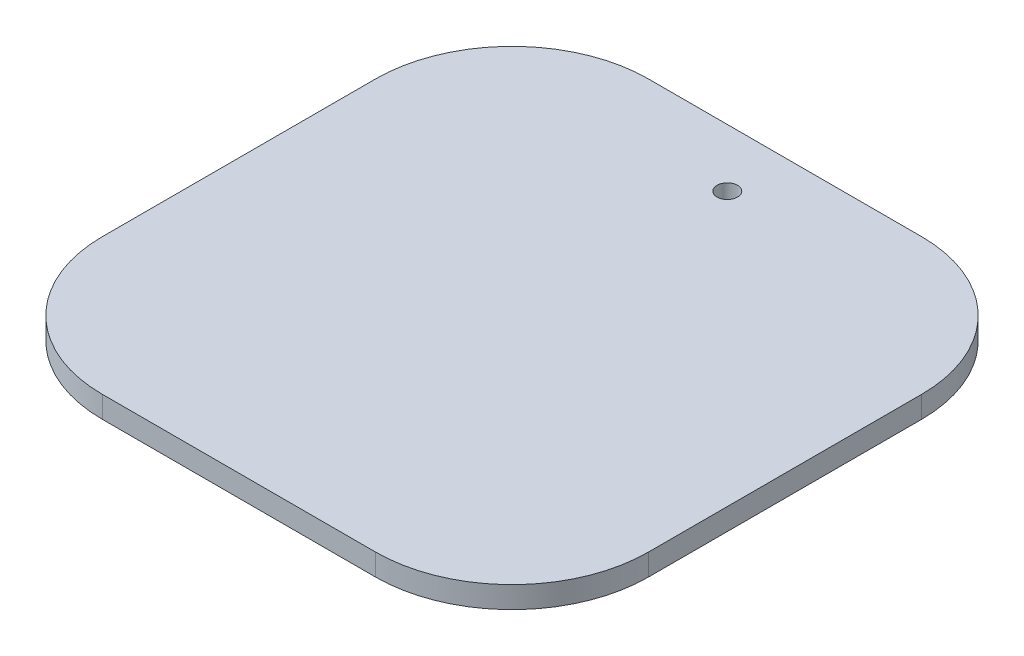
ISO-10303-21;
HEADER;
FILE_DESCRIPTION(('STEP AP214'),'2;1');
FILE_NAME('part.step','',(''),(''),'','','');
FILE_SCHEMA(('AUTOMOTIVE_DESIGN { 1 0 10303 214 1 1 1 1 }'));
ENDSEC;
DATA;
#1=APPLICATION_CONTEXT('core data for automotive mechanical design processes');
#2=APPLICATION_PROTOCOL_DEFINITION('international standard','automotive_design',2000,#1);
#3=PRODUCT_CONTEXT('',#1,'mechanical');
#4=PRODUCT('Part','Part','',(#3));
#5=PRODUCT_RELATED_PRODUCT_CATEGORY('part','',(#4));
#6=PRODUCT_DEFINITION_FORMATION('','',#4);
#7=PRODUCT_DEFINITION_CONTEXT('part definition',#1,'design');
#8=PRODUCT_DEFINITION('design','',#6,#7);
#9=PRODUCT_DEFINITION_SHAPE('','',#8);
#10=(LENGTH_UNIT() NAMED_UNIT(*) SI_UNIT(.MILLI.,.METRE.));
#11=(NAMED_UNIT(*) PLANE_ANGLE_UNIT() SI_UNIT($,.RADIAN.));
#12=(NAMED_UNIT(*) SI_UNIT($,.STERADIAN.) SOLID_ANGLE_UNIT());
#13=UNCERTAINTY_MEASURE_WITH_UNIT(LENGTH_MEASURE(1.E-05),#10,'distance_accuracy_value','');
#14=(GEOMETRIC_REPRESENTATION_CONTEXT(3) GLOBAL_UNCERTAINTY_ASSIGNED_CONTEXT((#13)) GLOBAL_UNIT_ASSIGNED_CONTEXT((#10,
#11,#12)) REPRESENTATION_CONTEXT('',''));
#15=CARTESIAN_POINT('',(0.,0.,0.));
#16=DIRECTION('',(0.,0.,1.));
#17=DIRECTION('',(1.,0.,0.));
#18=AXIS2_PLACEMENT_3D('',#15,#16,#17);
#19=CARTESIAN_POINT('',(30.,4.7625,30.));
#20=DIRECTION('',(0.,-1.,0.));
#21=DIRECTION('',(0.,0.,-1.));
#22=AXIS2_PLACEMENT_3D('',#19,#20,#21);
#23=CYLINDRICAL_SURFACE('',#22,30.);
#24=CARTESIAN_POINT('',(30.,0.,30.));
#25=DIRECTION('',(0.,1.,0.));
#26=DIRECTION('',(0.,0.,1.));
#27=AXIS2_PLACEMENT_3D('',#24,#25,#26);
#28=CIRCLE('',#27,30.);
#29=CARTESIAN_POINT('',(29.9999999999998,0.,60.));
#30=VERTEX_POINT('',#29);
#31=CARTESIAN_POINT('',(60.,0.,29.9999999999998));
#32=VERTEX_POINT('',#31);
#33=EDGE_CURVE('E132',#30,#32,#28,.T.);
#34=ORIENTED_EDGE('',*,*,#33,.T.);
#35=DIRECTION('',(0.,-1.,0.));
#36=VECTOR('',#35,1.);
#37=CARTESIAN_POINT('',(60.,4.7625,29.9999999999998));
#38=LINE('',#37,#36);
#39=CARTESIAN_POINT('',(60.,4.7625,29.9999999999998));
#40=VERTEX_POINT('',#39);
#41=EDGE_CURVE('E11',#40,#32,#38,.T.);
#42=ORIENTED_EDGE('',*,*,#41,.F.);
#43=CARTESIAN_POINT('',(30.,4.7625,30.));
#44=DIRECTION('',(0.,1.,0.));
#45=DIRECTION('',(0.,0.,1.));
#46=AXIS2_PLACEMENT_3D('',#43,#44,#45);
#47=CIRCLE('',#46,30.);
#48=CARTESIAN_POINT('',(29.9999999999998,4.7625,60.));
#49=VERTEX_POINT('',#48);
#50=EDGE_CURVE('E146',#49,#40,#47,.T.);
#51=ORIENTED_EDGE('',*,*,#50,.F.);
#52=DIRECTION('',(0.,-1.,0.));
#53=VECTOR('',#52,1.);
#54=CARTESIAN_POINT('',(29.9999999999998,4.7625,60.));
#55=LINE('',#54,#53);
#56=EDGE_CURVE('E128',#49,#30,#55,.T.);
#57=ORIENTED_EDGE('',*,*,#56,.T.);
#58=EDGE_LOOP('',(#34,#42,#51,#57));
#59=FACE_BOUND('',#58,.T.);
#60=ADVANCED_FACE('F35',(#59),#23,.T.);
#61=CARTESIAN_POINT('',(60.,4.7625,-29.9999999999998));
#62=DIRECTION('',(-1.,0.,0.));
#63=DIRECTION('',(0.,0.,1.));
#64=AXIS2_PLACEMENT_3D('',#61,#62,#63);
#65=PLANE('',#64);
#66=DIRECTION('',(0.,0.,-1.));
#67=VECTOR('',#66,1.);
#68=CARTESIAN_POINT('',(60.,0.,-29.9999999999998));
#69=LINE('',#68,#67);
#70=CARTESIAN_POINT('',(60.,0.,-29.9999999999998));
#71=VERTEX_POINT('',#70);
#72=EDGE_CURVE('E135',#32,#71,#69,.T.);
#73=ORIENTED_EDGE('',*,*,#72,.T.);
#74=DIRECTION('',(0.,-1.,0.));
#75=VECTOR('',#74,1.);
#76=CARTESIAN_POINT('',(60.,4.7625,-29.9999999999998));
#77=LINE('',#76,#75);
#78=CARTESIAN_POINT('',(60.,4.7625,-29.9999999999998));
#79=VERTEX_POINT('',#78);
#80=EDGE_CURVE('E44',#79,#71,#77,.T.);
#81=ORIENTED_EDGE('',*,*,#80,.F.);
#82=DIRECTION('',(0.,0.,-1.));
#83=VECTOR('',#82,1.);
#84=CARTESIAN_POINT('',(60.,4.7625,-29.9999999999998));
#85=LINE('',#84,#83);
#86=EDGE_CURVE('E95',#40,#79,#85,.T.);
#87=ORIENTED_EDGE('',*,*,#86,.F.);
#88=ORIENTED_EDGE('',*,*,#41,.T.);
#89=EDGE_LOOP('',(#73,#81,#87,#88));
#90=FACE_BOUND('',#89,.T.);
#91=ADVANCED_FACE('F197',(#90),#65,.F.);
#92=CARTESIAN_POINT('',(30.,4.7625,-30.));
#93=DIRECTION('',(0.,-1.,0.));
#94=DIRECTION('',(0.,0.,-1.));
#95=AXIS2_PLACEMENT_3D('',#92,#93,#94);
#96=CYLINDRICAL_SURFACE('',#95,30.);
#97=CARTESIAN_POINT('',(30.,0.,-30.));
#98=DIRECTION('',(0.,1.,0.));
#99=DIRECTION('',(0.,0.,1.));
#100=AXIS2_PLACEMENT_3D('',#97,#98,#99);
#101=CIRCLE('',#100,30.);
#102=CARTESIAN_POINT('',(29.9999999999998,0.,-60.));
#103=VERTEX_POINT('',#102);
#104=EDGE_CURVE('E137',#71,#103,#101,.T.);
#105=ORIENTED_EDGE('',*,*,#104,.T.);
#106=DIRECTION('',(0.,-1.,0.));
#107=VECTOR('',#106,1.);
#108=CARTESIAN_POINT('',(29.9999999999998,4.7625,-60.));
#109=LINE('',#108,#107);
#110=CARTESIAN_POINT('',(29.9999999999998,4.7625,-60.));
#111=VERTEX_POINT('',#110);
#112=EDGE_CURVE('E153',#111,#103,#109,.T.);
#113=ORIENTED_EDGE('',*,*,#112,.F.);
#114=CARTESIAN_POINT('',(30.,4.7625,-30.));
#115=DIRECTION('',(0.,1.,0.));
#116=DIRECTION('',(0.,0.,1.));
#117=AXIS2_PLACEMENT_3D('',#114,#115,#116);
#118=CIRCLE('',#117,30.);
#119=EDGE_CURVE('E162',#79,#111,#118,.T.);
#120=ORIENTED_EDGE('',*,*,#119,.F.);
#121=ORIENTED_EDGE('',*,*,#80,.T.);
#122=EDGE_LOOP('',(#105,#113,#120,#121));
#123=FACE_BOUND('',#122,.T.);
#124=ADVANCED_FACE('F160',(#123),#96,.T.);
#125=CARTESIAN_POINT('',(-29.9999999999998,4.7625,-60.));
#126=DIRECTION('',(0.,0.,1.));
#127=DIRECTION('',(1.,0.,0.));
#128=AXIS2_PLACEMENT_3D('',#125,#126,#127);
#129=PLANE('',#128);
#130=DIRECTION('',(-1.,0.,0.));
#131=VECTOR('',#130,1.);
#132=CARTESIAN_POINT('',(-29.9999999999998,0.,-60.));
#133=LINE('',#132,#131);
#134=CARTESIAN_POINT('',(-29.9999999999998,0.,-60.));
#135=VERTEX_POINT('',#134);
#136=EDGE_CURVE('E139',#103,#135,#133,.T.);
#137=ORIENTED_EDGE('',*,*,#136,.T.);
#138=DIRECTION('',(0.,-1.,0.));
#139=VECTOR('',#138,1.);
#140=CARTESIAN_POINT('',(-29.9999999999998,4.7625,-60.));
#141=LINE('',#140,#139);
#142=CARTESIAN_POINT('',(-29.9999999999998,4.7625,-60.));
#143=VERTEX_POINT('',#142);
#144=EDGE_CURVE('E150',#143,#135,#141,.T.);
#145=ORIENTED_EDGE('',*,*,#144,.F.);
#146=DIRECTION('',(-1.,0.,0.));
#147=VECTOR('',#146,1.);
#148=CARTESIAN_POINT('',(-29.9999999999998,4.7625,-60.));
#149=LINE('',#148,#147);
#150=EDGE_CURVE('E174',#111,#143,#149,.T.);
#151=ORIENTED_EDGE('',*,*,#150,.F.);
#152=ORIENTED_EDGE('',*,*,#112,.T.);
#153=EDGE_LOOP('',(#137,#145,#151,#152));
#154=FACE_BOUND('',#153,.T.);
#155=ADVANCED_FACE('F170',(#154),#129,.F.);
#156=CARTESIAN_POINT('',(-30.,4.7625,-30.));
#157=DIRECTION('',(0.,-1.,0.));
#158=DIRECTION('',(0.,0.,-1.));
#159=AXIS2_PLACEMENT_3D('',#156,#157,#158);
#160=CYLINDRICAL_SURFACE('',#159,30.);
#161=CARTESIAN_POINT('',(-30.,0.,-30.));
#162=DIRECTION('',(0.,1.,0.));
#163=DIRECTION('',(0.,0.,1.));
#164=AXIS2_PLACEMENT_3D('',#161,#162,#163);
#165=CIRCLE('',#164,30.);
#166=CARTESIAN_POINT('',(-60.,0.,-29.9999999999998));
#167=VERTEX_POINT('',#166);
#168=EDGE_CURVE('E141',#135,#167,#165,.T.);
#169=ORIENTED_EDGE('',*,*,#168,.T.);
#170=DIRECTION('',(0.,-1.,0.));
#171=VECTOR('',#170,1.);
#172=CARTESIAN_POINT('',(-60.,4.7625,-29.9999999999998));
#173=LINE('',#172,#171);
#174=CARTESIAN_POINT('',(-60.,4.7625,-29.9999999999998));
#175=VERTEX_POINT('',#174);
#176=EDGE_CURVE('E123',#175,#167,#173,.T.);
#177=ORIENTED_EDGE('',*,*,#176,.F.);
#178=CARTESIAN_POINT('',(-30.,4.7625,-30.));
#179=DIRECTION('',(0.,1.,0.));
#180=DIRECTION('',(0.,0.,1.));
#181=AXIS2_PLACEMENT_3D('',#178,#179,#180);
#182=CIRCLE('',#181,30.);
#183=EDGE_CURVE('E114',#143,#175,#182,.T.);
#184=ORIENTED_EDGE('',*,*,#183,.F.);
#185=ORIENTED_EDGE('',*,*,#144,.T.);
#186=EDGE_LOOP('',(#169,#177,#184,#185));
#187=FACE_BOUND('',#186,.T.);
#188=ADVANCED_FACE('F173',(#187),#160,.T.);
#189=CARTESIAN_POINT('',(-60.,4.7625,-29.9999999999998));
#190=DIRECTION('',(1.,0.,0.));
#191=DIRECTION('',(0.,0.,-1.));
#192=AXIS2_PLACEMENT_3D('',#189,#190,#191);
#193=PLANE('',#192);
#194=DIRECTION('',(0.,0.,1.));
#195=VECTOR('',#194,1.);
#196=CARTESIAN_POINT('',(-60.,0.,-29.9999999999998));
#197=LINE('',#196,#195);
#198=CARTESIAN_POINT('',(-60.,0.,29.9999999999998));
#199=VERTEX_POINT('',#198);
#200=EDGE_CURVE('E122',#167,#199,#197,.T.);
#201=ORIENTED_EDGE('',*,*,#200,.T.);
#202=DIRECTION('',(0.,-1.,0.));
#203=VECTOR('',#202,1.);
#204=CARTESIAN_POINT('',(-60.,4.7625,29.9999999999998));
#205=LINE('',#204,#203);
#206=CARTESIAN_POINT('',(-60.,4.7625,29.9999999999998));
#207=VERTEX_POINT('',#206);
#208=EDGE_CURVE('E119',#207,#199,#205,.T.);
#209=ORIENTED_EDGE('',*,*,#208,.F.);
#210=DIRECTION('',(0.,0.,1.));
#211=VECTOR('',#210,1.);
#212=CARTESIAN_POINT('',(-60.,4.7625,-29.9999999999998));
#213=LINE('',#212,#211);
#214=EDGE_CURVE('E108',#175,#207,#213,.T.);
#215=ORIENTED_EDGE('',*,*,#214,.F.);
#216=ORIENTED_EDGE('',*,*,#176,.T.);
#217=EDGE_LOOP('',(#201,#209,#215,#216));
#218=FACE_BOUND('',#217,.T.);
#219=ADVANCED_FACE('F120',(#218),#193,.F.);
#220=CARTESIAN_POINT('',(-30.,4.7625,30.));
#221=DIRECTION('',(0.,-1.,0.));
#222=DIRECTION('',(0.,0.,-1.));
#223=AXIS2_PLACEMENT_3D('',#220,#221,#222);
#224=CYLINDRICAL_SURFACE('',#223,30.);
#225=CARTESIAN_POINT('',(-30.,0.,30.));
#226=DIRECTION('',(0.,1.,0.));
#227=DIRECTION('',(0.,0.,1.));
#228=AXIS2_PLACEMENT_3D('',#225,#226,#227);
#229=CIRCLE('',#228,30.);
#230=CARTESIAN_POINT('',(-29.9999999999998,0.,60.));
#231=VERTEX_POINT('',#230);
#232=EDGE_CURVE('E81',#199,#231,#229,.T.);
#233=ORIENTED_EDGE('',*,*,#232,.T.);
#234=DIRECTION('',(0.,-1.,0.));
#235=VECTOR('',#234,1.);
#236=CARTESIAN_POINT('',(-29.9999999999998,4.7625,60.));
#237=LINE('',#236,#235);
#238=CARTESIAN_POINT('',(-29.9999999999998,4.7625,60.));
#239=VERTEX_POINT('',#238);
#240=EDGE_CURVE('E124',#239,#231,#237,.T.);
#241=ORIENTED_EDGE('',*,*,#240,.F.);
#242=CARTESIAN_POINT('',(-30.,4.7625,30.));
#243=DIRECTION('',(0.,1.,0.));
#244=DIRECTION('',(0.,0.,1.));
#245=AXIS2_PLACEMENT_3D('',#242,#243,#244);
#246=CIRCLE('',#245,30.);
#247=EDGE_CURVE('E112',#207,#239,#246,.T.);
#248=ORIENTED_EDGE('',*,*,#247,.F.);
#249=ORIENTED_EDGE('',*,*,#208,.T.);
#250=EDGE_LOOP('',(#233,#241,#248,#249));
#251=FACE_BOUND('',#250,.T.);
#252=ADVANCED_FACE('F126',(#251),#224,.T.);
#253=CARTESIAN_POINT('',(-29.9999999999998,4.7625,60.));
#254=DIRECTION('',(0.,0.,-1.));
#255=DIRECTION('',(-1.,0.,0.));
#256=AXIS2_PLACEMENT_3D('',#253,#254,#255);
#257=PLANE('',#256);
#258=DIRECTION('',(1.,0.,0.));
#259=VECTOR('',#258,1.);
#260=CARTESIAN_POINT('',(-29.9999999999998,0.,60.));
#261=LINE('',#260,#259);
#262=EDGE_CURVE('E87',#231,#30,#261,.T.);
#263=ORIENTED_EDGE('',*,*,#262,.T.);
#264=ORIENTED_EDGE('',*,*,#56,.F.);
#265=DIRECTION('',(1.,0.,0.));
#266=VECTOR('',#265,1.);
#267=CARTESIAN_POINT('',(-29.9999999999998,4.7625,60.));
#268=LINE('',#267,#266);
#269=EDGE_CURVE('E52',#239,#49,#268,.T.);
#270=ORIENTED_EDGE('',*,*,#269,.F.);
#271=ORIENTED_EDGE('',*,*,#240,.T.);
#272=EDGE_LOOP('',(#263,#264,#270,#271));
#273=FACE_BOUND('',#272,.T.);
#274=ADVANCED_FACE('F204',(#273),#257,.F.);
#275=CARTESIAN_POINT('',(30.,4.7625,30.));
#276=DIRECTION('',(0.,1.,0.));
#277=DIRECTION('',(0.,0.,1.));
#278=AXIS2_PLACEMENT_3D('',#275,#276,#277);
#279=PLANE('',#278);
#280=CARTESIAN_POINT('',(0.,4.7625,-47.3));
#281=DIRECTION('',(0.,1.,0.));
#282=DIRECTION('',(0.,0.,1.));
#283=AXIS2_PLACEMENT_3D('',#280,#281,#282);
#284=CIRCLE('',#283,2.24999999999999);
#285=CARTESIAN_POINT('',(0.,4.7625,-45.05));
#286=VERTEX_POINT('',#285);
#287=EDGE_CURVE('E180',#286,#286,#284,.T.);
#288=ORIENTED_EDGE('',*,*,#287,.F.);
#289=EDGE_LOOP('',(#288));
#290=FACE_BOUND('',#289,.T.);
#291=ORIENTED_EDGE('',*,*,#50,.T.);
#292=ORIENTED_EDGE('',*,*,#86,.T.);
#293=ORIENTED_EDGE('',*,*,#119,.T.);
#294=ORIENTED_EDGE('',*,*,#150,.T.);
#295=ORIENTED_EDGE('',*,*,#183,.T.);
#296=ORIENTED_EDGE('',*,*,#214,.T.);
#297=ORIENTED_EDGE('',*,*,#247,.T.);
#298=ORIENTED_EDGE('',*,*,#269,.T.);
#299=EDGE_LOOP('',(#291,#292,#293,#294,#295,#296,#297,#298));
#300=FACE_BOUND('',#299,.T.);
#301=ADVANCED_FACE('F110',(#290,#300),#279,.T.);
#302=CARTESIAN_POINT('',(30.,0.,30.));
#303=DIRECTION('',(0.,1.,0.));
#304=DIRECTION('',(0.,0.,1.));
#305=AXIS2_PLACEMENT_3D('',#302,#303,#304);
#306=PLANE('',#305);
#307=CARTESIAN_POINT('',(0.,0.,-47.3));
#308=DIRECTION('',(0.,1.,0.));
#309=DIRECTION('',(0.,0.,1.));
#310=AXIS2_PLACEMENT_3D('',#307,#308,#309);
#311=CIRCLE('',#310,2.24999999999999);
#312=CARTESIAN_POINT('',(0.,0.,-45.05));
#313=VERTEX_POINT('',#312);
#314=EDGE_CURVE('E38',#313,#313,#311,.T.);
#315=ORIENTED_EDGE('',*,*,#314,.T.);
#316=EDGE_LOOP('',(#315));
#317=FACE_BOUND('',#316,.T.);
#318=ORIENTED_EDGE('',*,*,#33,.F.);
#319=ORIENTED_EDGE('',*,*,#262,.F.);
#320=ORIENTED_EDGE('',*,*,#232,.F.);
#321=ORIENTED_EDGE('',*,*,#200,.F.);
#322=ORIENTED_EDGE('',*,*,#168,.F.);
#323=ORIENTED_EDGE('',*,*,#136,.F.);
#324=ORIENTED_EDGE('',*,*,#104,.F.);
#325=ORIENTED_EDGE('',*,*,#72,.F.);
#326=EDGE_LOOP('',(#318,#319,#320,#321,#322,#323,#324,#325));
#327=FACE_BOUND('',#326,.T.);
#328=ADVANCED_FACE('F166',(#317,#327),#306,.F.);
#329=CARTESIAN_POINT('',(0.,4.7625,-47.3));
#330=DIRECTION('',(0.,1.,0.));
#331=DIRECTION('',(0.,0.,1.));
#332=AXIS2_PLACEMENT_3D('',#329,#330,#331);
#333=CYLINDRICAL_SURFACE('',#332,2.24999999999999);
#334=ORIENTED_EDGE('',*,*,#287,.T.);
#335=EDGE_LOOP('',(#334));
#336=FACE_BOUND('',#335,.T.);
#337=ORIENTED_EDGE('',*,*,#314,.F.);
#338=EDGE_LOOP('',(#337));
#339=FACE_BOUND('',#338,.T.);
#340=ADVANCED_FACE('F188',(#336,#339),#333,.F.);
#341=CLOSED_SHELL('',(#60,#91,#124,#155,#188,#219,#252,#274,#301,#328,#340));
#342=MANIFOLD_SOLID_BREP('B2',#341);
#343=ADVANCED_BREP_SHAPE_REPRESENTATION('',(#18,#342),#14);
#344=SHAPE_DEFINITION_REPRESENTATION(#9,#343);
ENDSEC;
END-ISO-10303-21;
